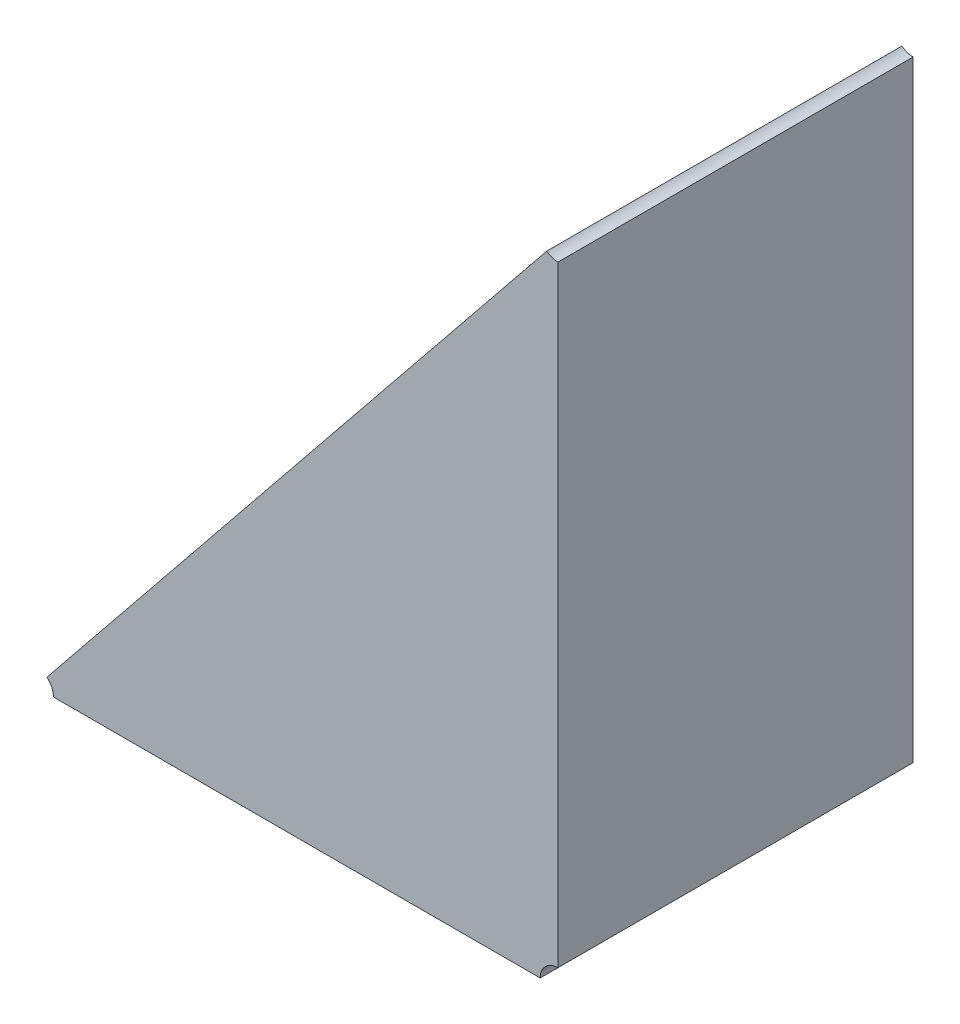
ISO-10303-21;
HEADER;
FILE_DESCRIPTION(('STEP AP214'),'2;1');
FILE_NAME('part.step','',(''),(''),'','','');
FILE_SCHEMA(('AUTOMOTIVE_DESIGN { 1 0 10303 214 1 1 1 1 }'));
ENDSEC;
DATA;
#1=APPLICATION_CONTEXT('core data for automotive mechanical design processes');
#2=APPLICATION_PROTOCOL_DEFINITION('international standard','automotive_design',2000,#1);
#3=PRODUCT_CONTEXT('',#1,'mechanical');
#4=PRODUCT('Part','Part','',(#3));
#5=PRODUCT_RELATED_PRODUCT_CATEGORY('part','',(#4));
#6=PRODUCT_DEFINITION_FORMATION('','',#4);
#7=PRODUCT_DEFINITION_CONTEXT('part definition',#1,'design');
#8=PRODUCT_DEFINITION('design','',#6,#7);
#9=PRODUCT_DEFINITION_SHAPE('','',#8);
#10=(LENGTH_UNIT() NAMED_UNIT(*) SI_UNIT(.MILLI.,.METRE.));
#11=(NAMED_UNIT(*) PLANE_ANGLE_UNIT() SI_UNIT($,.RADIAN.));
#12=(NAMED_UNIT(*) SI_UNIT($,.STERADIAN.) SOLID_ANGLE_UNIT());
#13=UNCERTAINTY_MEASURE_WITH_UNIT(LENGTH_MEASURE(1.E-05),#10,'distance_accuracy_value','');
#14=(GEOMETRIC_REPRESENTATION_CONTEXT(3) GLOBAL_UNCERTAINTY_ASSIGNED_CONTEXT((#13)) GLOBAL_UNIT_ASSIGNED_CONTEXT((#10,
#11,#12)) REPRESENTATION_CONTEXT('',''));
#15=CARTESIAN_POINT('',(0.,0.,0.));
#16=DIRECTION('',(0.,0.,1.));
#17=DIRECTION('',(1.,0.,0.));
#18=AXIS2_PLACEMENT_3D('',#15,#16,#17);
#19=CARTESIAN_POINT('',(-1.848667050412,-1.22650919463,0.1));
#20=DIRECTION('',(0.,0.,1.));
#21=DIRECTION('',(-1.,0.,0.));
#22=AXIS2_PLACEMENT_3D('',#19,#20,#21);
#23=CYLINDRICAL_SURFACE('',#22,0.00499999999999994);
#24=DIRECTION('',(0.,0.,1.));
#25=VECTOR('',#24,1.);
#26=CARTESIAN_POINT('',(-1.84552560437,-1.222619295305,0.1));
#27=LINE('',#26,#25);
#28=CARTESIAN_POINT('',(-1.84552560437,-1.222619295305,0.));
#29=VERTEX_POINT('',#28);
#30=CARTESIAN_POINT('',(-1.84552560437,-1.222619295305,0.1));
#31=VERTEX_POINT('',#30);
#32=EDGE_CURVE('E11',#29,#31,#27,.T.);
#33=ORIENTED_EDGE('',*,*,#32,.F.);
#34=CARTESIAN_POINT('',(-1.848667050412,-1.22650919463,0.));
#35=DIRECTION('',(0.,0.,1.));
#36=DIRECTION('',(-1.,0.,0.));
#37=AXIS2_PLACEMENT_3D('',#34,#35,#36);
#38=CIRCLE('',#37,0.00499999999999994);
#39=CARTESIAN_POINT('',(-1.843667050412,-1.22650919463,0.));
#40=VERTEX_POINT('',#39);
#41=EDGE_CURVE('E24',#40,#29,#38,.T.);
#42=ORIENTED_EDGE('',*,*,#41,.F.);
#43=DIRECTION('',(0.,0.,-1.));
#44=VECTOR('',#43,1.);
#45=CARTESIAN_POINT('',(-1.843667050412,-1.22650919463,0.1));
#46=LINE('',#45,#44);
#47=CARTESIAN_POINT('',(-1.843667050412,-1.22650919463,0.1));
#48=VERTEX_POINT('',#47);
#49=EDGE_CURVE('E113',#48,#40,#46,.T.);
#50=ORIENTED_EDGE('',*,*,#49,.F.);
#51=CARTESIAN_POINT('',(-1.848667050412,-1.22650919463,0.1));
#52=DIRECTION('',(0.,0.,-1.));
#53=DIRECTION('',(-1.,0.,0.));
#54=AXIS2_PLACEMENT_3D('',#51,#52,#53);
#55=CIRCLE('',#54,0.00499999999999994);
#56=EDGE_CURVE('E37',#31,#48,#55,.T.);
#57=ORIENTED_EDGE('',*,*,#56,.F.);
#58=EDGE_LOOP('',(#33,#42,#50,#57));
#59=FACE_BOUND('',#58,.T.);
#60=ADVANCED_FACE('F17',(#59),#23,.F.);
#61=CARTESIAN_POINT('',(-1.701648957739,-1.22650919463,0.1));
#62=DIRECTION('',(0.,0.,1.));
#63=DIRECTION('',(-1.,0.,0.));
#64=AXIS2_PLACEMENT_3D('',#61,#62,#63);
#65=CYLINDRICAL_SURFACE('',#64,0.00499999999999999);
#66=DIRECTION('',(0.,0.,-1.));
#67=VECTOR('',#66,1.);
#68=CARTESIAN_POINT('',(-1.701648957739,-1.22150919463,0.1));
#69=LINE('',#68,#67);
#70=CARTESIAN_POINT('',(-1.701648957739,-1.22150919463,0.1));
#71=VERTEX_POINT('',#70);
#72=CARTESIAN_POINT('',(-1.701648957739,-1.22150919463,0.));
#73=VERTEX_POINT('',#72);
#74=EDGE_CURVE('E90',#71,#73,#69,.T.);
#75=ORIENTED_EDGE('',*,*,#74,.F.);
#76=CARTESIAN_POINT('',(-1.701648957739,-1.22650919463,0.1));
#77=DIRECTION('',(0.,0.,-1.));
#78=DIRECTION('',(-1.,0.,0.));
#79=AXIS2_PLACEMENT_3D('',#76,#77,#78);
#80=CIRCLE('',#79,0.00499999999999999);
#81=CARTESIAN_POINT('',(-1.706648957739,-1.22650919463,0.1));
#82=VERTEX_POINT('',#81);
#83=EDGE_CURVE('E109',#82,#71,#80,.T.);
#84=ORIENTED_EDGE('',*,*,#83,.F.);
#85=DIRECTION('',(0.,0.,1.));
#86=VECTOR('',#85,1.);
#87=CARTESIAN_POINT('',(-1.706648957739,-1.22650919463,0.1));
#88=LINE('',#87,#86);
#89=CARTESIAN_POINT('',(-1.706648957739,-1.22650919463,0.));
#90=VERTEX_POINT('',#89);
#91=EDGE_CURVE('E107',#90,#82,#88,.T.);
#92=ORIENTED_EDGE('',*,*,#91,.F.);
#93=CARTESIAN_POINT('',(-1.701648957739,-1.22650919463,0.));
#94=DIRECTION('',(0.,0.,1.));
#95=DIRECTION('',(-1.,0.,0.));
#96=AXIS2_PLACEMENT_3D('',#93,#94,#95);
#97=CIRCLE('',#96,0.00499999999999999);
#98=EDGE_CURVE('E105',#73,#90,#97,.T.);
#99=ORIENTED_EDGE('',*,*,#98,.F.);
#100=EDGE_LOOP('',(#75,#84,#92,#99));
#101=FACE_BOUND('',#100,.T.);
#102=ADVANCED_FACE('F121',(#101),#65,.F.);
#103=CARTESIAN_POINT('',(-1.701648957739,-1.044463865233,0.1));
#104=DIRECTION('',(0.,0.,1.));
#105=DIRECTION('',(-1.,0.,0.));
#106=AXIS2_PLACEMENT_3D('',#103,#104,#105);
#107=CYLINDRICAL_SURFACE('',#106,0.00499999999999997);
#108=DIRECTION('',(0.,0.,-1.));
#109=VECTOR('',#108,1.);
#110=CARTESIAN_POINT('',(-1.704790403781,-1.048353764559,0.1));
#111=LINE('',#110,#109);
#112=CARTESIAN_POINT('',(-1.704790403781,-1.048353764559,0.1));
#113=VERTEX_POINT('',#112);
#114=CARTESIAN_POINT('',(-1.704790403781,-1.048353764559,0.));
#115=VERTEX_POINT('',#114);
#116=EDGE_CURVE('E103',#113,#115,#111,.T.);
#117=ORIENTED_EDGE('',*,*,#116,.F.);
#118=CARTESIAN_POINT('',(-1.701648957739,-1.044463865233,0.1));
#119=DIRECTION('',(0.,0.,-1.));
#120=DIRECTION('',(-1.,0.,0.));
#121=AXIS2_PLACEMENT_3D('',#118,#119,#120);
#122=CIRCLE('',#121,0.00499999999999997);
#123=CARTESIAN_POINT('',(-1.701648957739,-1.049463865233,0.1));
#124=VERTEX_POINT('',#123);
#125=EDGE_CURVE('E82',#124,#113,#122,.T.);
#126=ORIENTED_EDGE('',*,*,#125,.F.);
#127=DIRECTION('',(0.,0.,1.));
#128=VECTOR('',#127,1.);
#129=CARTESIAN_POINT('',(-1.701648957739,-1.049463865233,0.1));
#130=LINE('',#129,#128);
#131=CARTESIAN_POINT('',(-1.701648957739,-1.049463865233,0.));
#132=VERTEX_POINT('',#131);
#133=EDGE_CURVE('E77',#132,#124,#130,.T.);
#134=ORIENTED_EDGE('',*,*,#133,.F.);
#135=CARTESIAN_POINT('',(-1.701648957739,-1.044463865233,0.));
#136=DIRECTION('',(0.,0.,1.));
#137=DIRECTION('',(-1.,0.,0.));
#138=AXIS2_PLACEMENT_3D('',#135,#136,#137);
#139=CIRCLE('',#138,0.00499999999999997);
#140=EDGE_CURVE('E67',#115,#132,#139,.T.);
#141=ORIENTED_EDGE('',*,*,#140,.F.);
#142=EDGE_LOOP('',(#117,#126,#134,#141));
#143=FACE_BOUND('',#142,.T.);
#144=ADVANCED_FACE('F81',(#143),#107,.F.);
#145=CARTESIAN_POINT('',(-1.701648957739,-1.22650919463,0.));
#146=DIRECTION('',(0.,1.,0.));
#147=DIRECTION('',(-1.,0.,0.));
#148=AXIS2_PLACEMENT_3D('',#145,#146,#147);
#149=PLANE('',#148);
#150=ORIENTED_EDGE('',*,*,#49,.T.);
#151=DIRECTION('',(-1.,0.,0.));
#152=VECTOR('',#151,1.);
#153=CARTESIAN_POINT('',(-1.701648957739,-1.22650919463,0.));
#154=LINE('',#153,#152);
#155=EDGE_CURVE('E78',#90,#40,#154,.T.);
#156=ORIENTED_EDGE('',*,*,#155,.F.);
#157=ORIENTED_EDGE('',*,*,#91,.T.);
#158=DIRECTION('',(-1.,0.,0.));
#159=VECTOR('',#158,1.);
#160=CARTESIAN_POINT('',(-1.701648957739,-1.22650919463,0.1));
#161=LINE('',#160,#159);
#162=EDGE_CURVE('E93',#82,#48,#161,.T.);
#163=ORIENTED_EDGE('',*,*,#162,.T.);
#164=EDGE_LOOP('',(#150,#156,#157,#163));
#165=FACE_BOUND('',#164,.T.);
#166=ADVANCED_FACE('F116',(#165),#149,.F.);
#167=CARTESIAN_POINT('',(-1.751391519029,-1.159253014978,0.));
#168=DIRECTION('',(0.,0.,-1.));
#169=DIRECTION('',(-1.,0.,0.));
#170=AXIS2_PLACEMENT_3D('',#167,#168,#169);
#171=PLANE('',#170);
#172=ORIENTED_EDGE('',*,*,#41,.T.);
#173=DIRECTION('',(0.628289208450209,0.777979865128275,0.));
#174=VECTOR('',#173,1.);
#175=CARTESIAN_POINT('',(-1.848667050412,-1.22650919463,0.));
#176=LINE('',#175,#174);
#177=EDGE_CURVE('E73',#29,#115,#176,.T.);
#178=ORIENTED_EDGE('',*,*,#177,.T.);
#179=ORIENTED_EDGE('',*,*,#140,.T.);
#180=DIRECTION('',(0.,-1.,0.));
#181=VECTOR('',#180,1.);
#182=CARTESIAN_POINT('',(-1.701648957739,-1.044463865233,0.));
#183=LINE('',#182,#181);
#184=EDGE_CURVE('E71',#132,#73,#183,.T.);
#185=ORIENTED_EDGE('',*,*,#184,.T.);
#186=ORIENTED_EDGE('',*,*,#98,.T.);
#187=ORIENTED_EDGE('',*,*,#155,.T.);
#188=EDGE_LOOP('',(#172,#178,#179,#185,#186,#187));
#189=FACE_BOUND('',#188,.T.);
#190=ADVANCED_FACE('F69',(#189),#171,.T.);
#191=CARTESIAN_POINT('',(-1.701648957739,-1.044463865233,0.));
#192=DIRECTION('',(-1.,0.,0.));
#193=DIRECTION('',(0.,-1.,0.));
#194=AXIS2_PLACEMENT_3D('',#191,#192,#193);
#195=PLANE('',#194);
#196=ORIENTED_EDGE('',*,*,#74,.T.);
#197=ORIENTED_EDGE('',*,*,#184,.F.);
#198=ORIENTED_EDGE('',*,*,#133,.T.);
#199=DIRECTION('',(0.,-1.,0.));
#200=VECTOR('',#199,1.);
#201=CARTESIAN_POINT('',(-1.701648957739,-1.044463865233,0.1));
#202=LINE('',#201,#200);
#203=EDGE_CURVE('E91',#124,#71,#202,.T.);
#204=ORIENTED_EDGE('',*,*,#203,.T.);
#205=EDGE_LOOP('',(#196,#197,#198,#204));
#206=FACE_BOUND('',#205,.T.);
#207=ADVANCED_FACE('F88',(#206),#195,.F.);
#208=CARTESIAN_POINT('',(-1.848667050412,-1.22650919463,0.));
#209=DIRECTION('',(0.777979865128275,-0.628289208450209,0.));
#210=DIRECTION('',(0.628289208450209,0.777979865128275,0.));
#211=AXIS2_PLACEMENT_3D('',#208,#209,#210);
#212=PLANE('',#211);
#213=ORIENTED_EDGE('',*,*,#32,.T.);
#214=DIRECTION('',(0.628289208450209,0.777979865128275,0.));
#215=VECTOR('',#214,1.);
#216=CARTESIAN_POINT('',(-1.848667050412,-1.22650919463,0.1));
#217=LINE('',#216,#215);
#218=EDGE_CURVE('E95',#31,#113,#217,.T.);
#219=ORIENTED_EDGE('',*,*,#218,.T.);
#220=ORIENTED_EDGE('',*,*,#116,.T.);
#221=ORIENTED_EDGE('',*,*,#177,.F.);
#222=EDGE_LOOP('',(#213,#219,#220,#221));
#223=FACE_BOUND('',#222,.T.);
#224=ADVANCED_FACE('F127',(#223),#212,.F.);
#225=CARTESIAN_POINT('',(-1.751391519029,-1.159253014978,0.1));
#226=DIRECTION('',(0.,0.,-1.));
#227=DIRECTION('',(-1.,0.,0.));
#228=AXIS2_PLACEMENT_3D('',#225,#226,#227);
#229=PLANE('',#228);
#230=ORIENTED_EDGE('',*,*,#56,.T.);
#231=ORIENTED_EDGE('',*,*,#162,.F.);
#232=ORIENTED_EDGE('',*,*,#83,.T.);
#233=ORIENTED_EDGE('',*,*,#203,.F.);
#234=ORIENTED_EDGE('',*,*,#125,.T.);
#235=ORIENTED_EDGE('',*,*,#218,.F.);
#236=EDGE_LOOP('',(#230,#231,#232,#233,#234,#235));
#237=FACE_BOUND('',#236,.T.);
#238=ADVANCED_FACE('F123',(#237),#229,.F.);
#239=CLOSED_SHELL('',(#60,#102,#144,#166,#190,#207,#224,#238));
#240=MANIFOLD_SOLID_BREP('B1',#239);
#241=ADVANCED_BREP_SHAPE_REPRESENTATION('',(#18,#240),#14);
#242=SHAPE_DEFINITION_REPRESENTATION(#9,#241);
ENDSEC;
END-ISO-10303-21;
